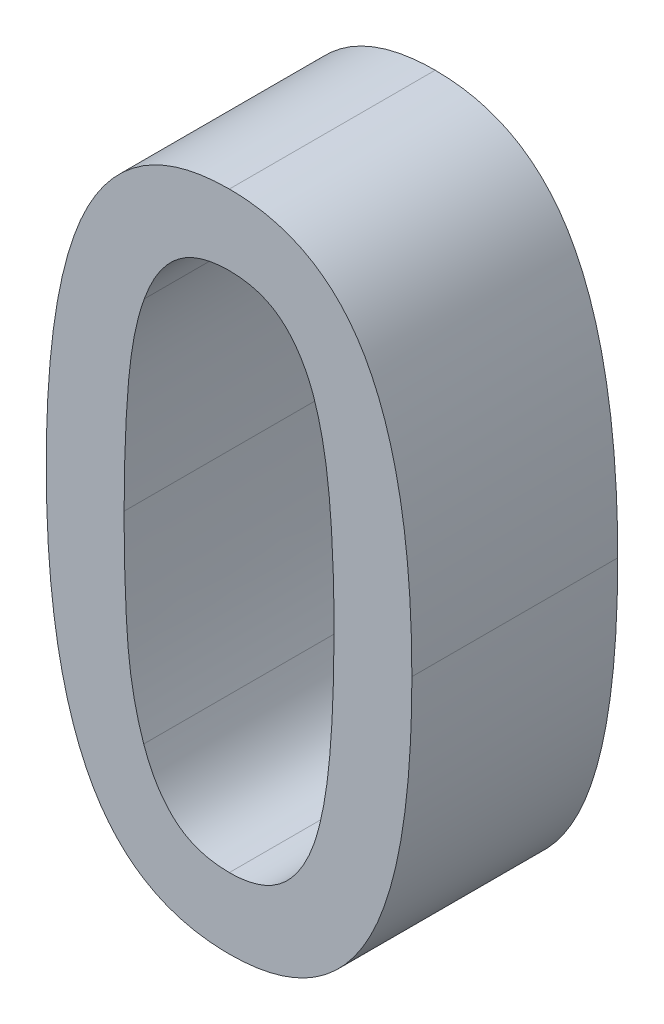
ISO-10303-21;
HEADER;
FILE_DESCRIPTION(('STEP AP214'),'2;1');
FILE_NAME('part.step','',(''),(''),'','','');
FILE_SCHEMA(('AUTOMOTIVE_DESIGN { 1 0 10303 214 1 1 1 1 }'));
ENDSEC;
DATA;
#1=APPLICATION_CONTEXT('core data for automotive mechanical design processes');
#2=APPLICATION_PROTOCOL_DEFINITION('international standard','automotive_design',2000,#1);
#3=PRODUCT_CONTEXT('',#1,'mechanical');
#4=PRODUCT('Part','Part','',(#3));
#5=PRODUCT_RELATED_PRODUCT_CATEGORY('part','',(#4));
#6=PRODUCT_DEFINITION_FORMATION('','',#4);
#7=PRODUCT_DEFINITION_CONTEXT('part definition',#1,'design');
#8=PRODUCT_DEFINITION('design','',#6,#7);
#9=PRODUCT_DEFINITION_SHAPE('','',#8);
#10=(LENGTH_UNIT() NAMED_UNIT(*) SI_UNIT(.MILLI.,.METRE.));
#11=(NAMED_UNIT(*) PLANE_ANGLE_UNIT() SI_UNIT($,.RADIAN.));
#12=(NAMED_UNIT(*) SI_UNIT($,.STERADIAN.) SOLID_ANGLE_UNIT());
#13=UNCERTAINTY_MEASURE_WITH_UNIT(LENGTH_MEASURE(1.E-05),#10,'distance_accuracy_value','');
#14=(GEOMETRIC_REPRESENTATION_CONTEXT(3) GLOBAL_UNCERTAINTY_ASSIGNED_CONTEXT((#13)) GLOBAL_UNIT_ASSIGNED_CONTEXT((#10,
#11,#12)) REPRESENTATION_CONTEXT('',''));
#15=CARTESIAN_POINT('',(0.,0.,0.));
#16=DIRECTION('',(0.,0.,1.));
#17=DIRECTION('',(1.,0.,0.));
#18=AXIS2_PLACEMENT_3D('',#15,#16,#17);
#19=CARTESIAN_POINT('',(-3.784527907438,0.217231574603514,0.));
#20=CARTESIAN_POINT('',(-3.784527907438,0.217231574603514,0.1));
#21=CARTESIAN_POINT('',(-3.769248087482,0.217231574603514,0.));
#22=CARTESIAN_POINT('',(-3.769248087482,0.217231574603514,0.1));
#23=CARTESIAN_POINT('',(-3.749208979342,0.233513349966919,0.));
#24=CARTESIAN_POINT('',(-3.749208979342,0.233513349966919,0.1));
#25=CARTESIAN_POINT('',(-3.743447735752,0.249795125330325,0.));
#26=CARTESIAN_POINT('',(-3.743447735752,0.249795125330325,0.1));
#27=B_SPLINE_SURFACE_WITH_KNOTS('',2,1,((#19,#20),(#21,#22),(#23,#24),(#25,#26)),.UNSPECIFIED.,
.F.,.F.,.F.,(3,1,3),(2,2),(0.,1.,2.),(0.,0.01),.UNSPECIFIED.);
#28=CARTESIAN_POINT('',(-3.784527907438,0.217231574603514,0.));
#29=CARTESIAN_POINT('',(-3.769248087482,0.217231574603514,0.));
#30=CARTESIAN_POINT('',(-3.749208979342,0.233513349966919,0.));
#31=CARTESIAN_POINT('',(-3.743447735752,0.249795125330325,0.));
#32=B_SPLINE_CURVE_WITH_KNOTS('',2,(#28,#29,#30,#31),.UNSPECIFIED.,.F.,.F.,(3,1,3),(0.,1.,2.),.UNSPECIFIED.);
#33=CARTESIAN_POINT('',(-3.784527907438,0.217231574603514,0.));
#34=VERTEX_POINT('',#33);
#35=CARTESIAN_POINT('',(-3.743447735752,0.249795125330325,0.));
#36=VERTEX_POINT('',#35);
#37=EDGE_CURVE('E11',#34,#36,#32,.T.);
#38=DIRECTION('',(0.,0.,1.));
#39=VECTOR('',#38,1.);
#40=CARTESIAN_POINT('',(-3.784527907438,0.217231574603514,0.));
#41=LINE('',#40,#39);
#42=CARTESIAN_POINT('',(-3.784527907438,0.217231574603514,0.1));
#43=VERTEX_POINT('',#42);
#44=EDGE_CURVE('E28',#34,#43,#41,.T.);
#45=CARTESIAN_POINT('',(-3.743447735752,0.249795125330325,0.1));
#46=CARTESIAN_POINT('',(-3.749208979342,0.233513349966919,0.1));
#47=CARTESIAN_POINT('',(-3.769248087482,0.217231574603514,0.1));
#48=CARTESIAN_POINT('',(-3.784527907438,0.217231574603514,0.1));
#49=B_SPLINE_CURVE_WITH_KNOTS('',2,(#45,#46,#47,#48),.UNSPECIFIED.,.F.,.F.,(3,1,3),(-2.,-1.,0.),.UNSPECIFIED.);
#50=CARTESIAN_POINT('',(-3.743447735752,0.249795125330325,0.1));
#51=VERTEX_POINT('',#50);
#52=EDGE_CURVE('E317',#51,#43,#49,.T.);
#53=DIRECTION('',(0.,0.,1.));
#54=VECTOR('',#53,1.);
#55=CARTESIAN_POINT('',(-3.743447735752,0.249795125330325,0.));
#56=LINE('',#55,#54);
#57=EDGE_CURVE('E41',#36,#51,#56,.T.);
#58=ORIENTED_EDGE('',*,*,#37,.F.);
#59=ORIENTED_EDGE('',*,*,#44,.T.);
#60=ORIENTED_EDGE('',*,*,#52,.F.);
#61=ORIENTED_EDGE('',*,*,#57,.F.);
#62=EDGE_LOOP('',(#58,#59,#60,#61));
#63=FACE_BOUND('',#62,.T.);
#64=ADVANCED_FACE('F17',(#63),#27,.F.);
#65=CARTESIAN_POINT('',(-3.826109056828,0.250546591885559,0.));
#66=CARTESIAN_POINT('',(-3.826109056828,0.250546591885559,0.1));
#67=CARTESIAN_POINT('',(-3.82059830209,0.234515305373898,0.));
#68=CARTESIAN_POINT('',(-3.82059830209,0.234515305373898,0.1));
#69=CARTESIAN_POINT('',(-3.800809682802,0.217231574603514,0.));
#70=CARTESIAN_POINT('',(-3.800809682802,0.217231574603514,0.1));
#71=CARTESIAN_POINT('',(-3.784527907438,0.217231574603514,0.));
#72=CARTESIAN_POINT('',(-3.784527907438,0.217231574603514,0.1));
#73=B_SPLINE_SURFACE_WITH_KNOTS('',2,1,((#65,#66),(#67,#68),(#69,#70),(#71,#72)),.UNSPECIFIED.,
.F.,.F.,.F.,(3,1,3),(2,2),(0.,1.,2.),(0.,0.01),.UNSPECIFIED.);
#74=CARTESIAN_POINT('',(-3.826109056828,0.250546591885559,0.));
#75=CARTESIAN_POINT('',(-3.82059830209,0.234515305373898,0.));
#76=CARTESIAN_POINT('',(-3.800809682802,0.217231574603514,0.));
#77=CARTESIAN_POINT('',(-3.784527907438,0.217231574603514,0.));
#78=B_SPLINE_CURVE_WITH_KNOTS('',2,(#74,#75,#76,#77),.UNSPECIFIED.,.F.,.F.,(3,1,3),(0.,1.,2.),.UNSPECIFIED.);
#79=CARTESIAN_POINT('',(-3.826109056828,0.250546591885559,0.));
#80=VERTEX_POINT('',#79);
#81=EDGE_CURVE('E308',#80,#34,#78,.T.);
#82=DIRECTION('',(0.,0.,1.));
#83=VECTOR('',#82,1.);
#84=CARTESIAN_POINT('',(-3.826109056828,0.250546591885559,0.));
#85=LINE('',#84,#83);
#86=CARTESIAN_POINT('',(-3.826109056828,0.250546591885559,0.1));
#87=VERTEX_POINT('',#86);
#88=EDGE_CURVE('E302',#80,#87,#85,.T.);
#89=CARTESIAN_POINT('',(-3.784527907438,0.217231574603514,0.1));
#90=CARTESIAN_POINT('',(-3.800809682802,0.217231574603514,0.1));
#91=CARTESIAN_POINT('',(-3.82059830209,0.234515305373898,0.1));
#92=CARTESIAN_POINT('',(-3.826109056828,0.250546591885559,0.1));
#93=B_SPLINE_CURVE_WITH_KNOTS('',2,(#89,#90,#91,#92),.UNSPECIFIED.,.F.,.F.,(3,1,3),(-2.,-1.,0.),.UNSPECIFIED.);
#94=EDGE_CURVE('E295',#43,#87,#93,.T.);
#95=ORIENTED_EDGE('',*,*,#81,.F.);
#96=ORIENTED_EDGE('',*,*,#88,.T.);
#97=ORIENTED_EDGE('',*,*,#94,.F.);
#98=ORIENTED_EDGE('',*,*,#44,.F.);
#99=EDGE_LOOP('',(#95,#96,#97,#98));
#100=FACE_BOUND('',#99,.T.);
#101=ADVANCED_FACE('F323',(#100),#73,.F.);
#102=CARTESIAN_POINT('',(-3.835627633194,0.343728444734587,0.));
#103=CARTESIAN_POINT('',(-3.835627633194,0.343728444734587,0.1));
#104=CARTESIAN_POINT('',(-3.835627633194,0.311164894007776,0.));
#105=CARTESIAN_POINT('',(-3.835627633194,0.311164894007776,0.1));
#106=CARTESIAN_POINT('',(-3.83212078927,0.267579833804199,0.));
#107=CARTESIAN_POINT('',(-3.83212078927,0.267579833804199,0.1));
#108=CARTESIAN_POINT('',(-3.826109056828,0.250546591885559,0.));
#109=CARTESIAN_POINT('',(-3.826109056828,0.250546591885559,0.1));
#110=B_SPLINE_SURFACE_WITH_KNOTS('',2,1,((#102,#103),(#104,#105),(#106,#107),(#108,#109)),
.UNSPECIFIED.,.F.,.F.,.F.,(3,1,3),(2,2),(0.,1.,2.),(0.,0.01),.UNSPECIFIED.);
#111=CARTESIAN_POINT('',(-3.835627633194,0.343728444734587,0.));
#112=CARTESIAN_POINT('',(-3.835627633194,0.311164894007776,0.));
#113=CARTESIAN_POINT('',(-3.83212078927,0.267579833804199,0.));
#114=CARTESIAN_POINT('',(-3.826109056828,0.250546591885559,0.));
#115=B_SPLINE_CURVE_WITH_KNOTS('',2,(#111,#112,#113,#114),.UNSPECIFIED.,.F.,.F.,(3,1,3),(0.,1.,
2.),.UNSPECIFIED.);
#116=CARTESIAN_POINT('',(-3.835627633194,0.343728444734587,0.));
#117=VERTEX_POINT('',#116);
#118=EDGE_CURVE('E290',#117,#80,#115,.T.);
#119=DIRECTION('',(0.,0.,1.));
#120=VECTOR('',#119,1.);
#121=CARTESIAN_POINT('',(-3.835627633194,0.343728444734587,0.));
#122=LINE('',#121,#120);
#123=CARTESIAN_POINT('',(-3.835627633194,0.343728444734587,0.1));
#124=VERTEX_POINT('',#123);
#125=EDGE_CURVE('E284',#117,#124,#122,.T.);
#126=CARTESIAN_POINT('',(-3.826109056828,0.250546591885559,0.1));
#127=CARTESIAN_POINT('',(-3.83212078927,0.267579833804199,0.1));
#128=CARTESIAN_POINT('',(-3.835627633194,0.311164894007776,0.1));
#129=CARTESIAN_POINT('',(-3.835627633194,0.343728444734587,0.1));
#130=B_SPLINE_CURVE_WITH_KNOTS('',2,(#126,#127,#128,#129),.UNSPECIFIED.,.F.,.F.,(3,1,3),(-2.,
-1.,0.),.UNSPECIFIED.);
#131=EDGE_CURVE('E277',#87,#124,#130,.T.);
#132=ORIENTED_EDGE('',*,*,#118,.F.);
#133=ORIENTED_EDGE('',*,*,#125,.T.);
#134=ORIENTED_EDGE('',*,*,#131,.F.);
#135=ORIENTED_EDGE('',*,*,#88,.F.);
#136=EDGE_LOOP('',(#132,#133,#134,#135));
#137=FACE_BOUND('',#136,.T.);
#138=ADVANCED_FACE('F336',(#137),#110,.F.);
#139=CARTESIAN_POINT('',(-3.825858567976,0.437912252990594,0.));
#140=CARTESIAN_POINT('',(-3.825858567976,0.437912252990594,0.1));
#141=CARTESIAN_POINT('',(-3.831619811566,0.422131455330678,0.));
#142=CARTESIAN_POINT('',(-3.831619811566,0.422131455330678,0.1));
#143=CARTESIAN_POINT('',(-3.835627633194,0.374037595795696,0.));
#144=CARTESIAN_POINT('',(-3.835627633194,0.374037595795696,0.1));
#145=CARTESIAN_POINT('',(-3.835627633194,0.343728444734587,0.));
#146=CARTESIAN_POINT('',(-3.835627633194,0.343728444734587,0.1));
#147=B_SPLINE_SURFACE_WITH_KNOTS('',2,1,((#139,#140),(#141,#142),(#143,#144),(#145,#146)),
.UNSPECIFIED.,.F.,.F.,.F.,(3,1,3),(2,2),(0.,1.,2.),(0.,0.01),.UNSPECIFIED.);
#148=CARTESIAN_POINT('',(-3.825858567976,0.437912252990594,0.));
#149=CARTESIAN_POINT('',(-3.831619811566,0.422131455330678,0.));
#150=CARTESIAN_POINT('',(-3.835627633194,0.374037595795696,0.));
#151=CARTESIAN_POINT('',(-3.835627633194,0.343728444734587,0.));
#152=B_SPLINE_CURVE_WITH_KNOTS('',2,(#148,#149,#150,#151),.UNSPECIFIED.,.F.,.F.,(3,1,3),(0.,1.,
2.),.UNSPECIFIED.);
#153=CARTESIAN_POINT('',(-3.825858567976,0.437912252990594,0.));
#154=VERTEX_POINT('',#153);
#155=EDGE_CURVE('E272',#154,#117,#152,.T.);
#156=DIRECTION('',(0.,0.,1.));
#157=VECTOR('',#156,1.);
#158=CARTESIAN_POINT('',(-3.825858567976,0.437912252990594,0.));
#159=LINE('',#158,#157);
#160=CARTESIAN_POINT('',(-3.825858567976,0.437912252990594,0.1));
#161=VERTEX_POINT('',#160);
#162=EDGE_CURVE('E266',#154,#161,#159,.T.);
#163=CARTESIAN_POINT('',(-3.835627633194,0.343728444734587,0.1));
#164=CARTESIAN_POINT('',(-3.835627633194,0.374037595795696,0.1));
#165=CARTESIAN_POINT('',(-3.831619811566,0.422131455330678,0.1));
#166=CARTESIAN_POINT('',(-3.825858567976,0.437912252990594,0.1));
#167=B_SPLINE_CURVE_WITH_KNOTS('',2,(#163,#164,#165,#166),.UNSPECIFIED.,.F.,.F.,(3,1,3),(-2.,
-1.,0.),.UNSPECIFIED.);
#168=EDGE_CURVE('E259',#124,#161,#167,.T.);
#169=ORIENTED_EDGE('',*,*,#155,.F.);
#170=ORIENTED_EDGE('',*,*,#162,.T.);
#171=ORIENTED_EDGE('',*,*,#168,.F.);
#172=ORIENTED_EDGE('',*,*,#125,.F.);
#173=EDGE_LOOP('',(#169,#170,#171,#172));
#174=FACE_BOUND('',#173,.T.);
#175=ADVANCED_FACE('F339',(#174),#147,.F.);
#176=CARTESIAN_POINT('',(-3.784527907438,0.470475803717405,0.));
#177=CARTESIAN_POINT('',(-3.784527907438,0.470475803717405,0.1));
#178=CARTESIAN_POINT('',(-3.800058216246,0.470475803717405,0.));
#179=CARTESIAN_POINT('',(-3.800058216246,0.470475803717405,0.1));
#180=CARTESIAN_POINT('',(-3.820097324386,0.454194028354,0.));
#181=CARTESIAN_POINT('',(-3.820097324386,0.454194028354,0.1));
#182=CARTESIAN_POINT('',(-3.825858567976,0.437912252990594,0.));
#183=CARTESIAN_POINT('',(-3.825858567976,0.437912252990594,0.1));
#184=B_SPLINE_SURFACE_WITH_KNOTS('',2,1,((#176,#177),(#178,#179),(#180,#181),(#182,#183)),
.UNSPECIFIED.,.F.,.F.,.F.,(3,1,3),(2,2),(0.,1.,2.),(0.,0.01),.UNSPECIFIED.);
#185=CARTESIAN_POINT('',(-3.784527907438,0.470475803717405,0.));
#186=CARTESIAN_POINT('',(-3.800058216246,0.470475803717405,0.));
#187=CARTESIAN_POINT('',(-3.820097324386,0.454194028354,0.));
#188=CARTESIAN_POINT('',(-3.825858567976,0.437912252990594,0.));
#189=B_SPLINE_CURVE_WITH_KNOTS('',2,(#185,#186,#187,#188),.UNSPECIFIED.,.F.,.F.,(3,1,3),(0.,1.,
2.),.UNSPECIFIED.);
#190=CARTESIAN_POINT('',(-3.784527907438,0.470475803717405,0.));
#191=VERTEX_POINT('',#190);
#192=EDGE_CURVE('E254',#191,#154,#189,.T.);
#193=DIRECTION('',(0.,0.,1.));
#194=VECTOR('',#193,1.);
#195=CARTESIAN_POINT('',(-3.784527907438,0.470475803717405,0.));
#196=LINE('',#195,#194);
#197=CARTESIAN_POINT('',(-3.784527907438,0.470475803717405,0.1));
#198=VERTEX_POINT('',#197);
#199=EDGE_CURVE('E248',#191,#198,#196,.T.);
#200=CARTESIAN_POINT('',(-3.825858567976,0.437912252990594,0.1));
#201=CARTESIAN_POINT('',(-3.820097324386,0.454194028354,0.1));
#202=CARTESIAN_POINT('',(-3.800058216246,0.470475803717405,0.1));
#203=CARTESIAN_POINT('',(-3.784527907438,0.470475803717405,0.1));
#204=B_SPLINE_CURVE_WITH_KNOTS('',2,(#200,#201,#202,#203),.UNSPECIFIED.,.F.,.F.,(3,1,3),(-2.,
-1.,0.),.UNSPECIFIED.);
#205=EDGE_CURVE('E241',#161,#198,#204,.T.);
#206=ORIENTED_EDGE('',*,*,#192,.F.);
#207=ORIENTED_EDGE('',*,*,#199,.T.);
#208=ORIENTED_EDGE('',*,*,#205,.F.);
#209=ORIENTED_EDGE('',*,*,#162,.F.);
#210=EDGE_LOOP('',(#206,#207,#208,#209));
#211=FACE_BOUND('',#210,.T.);
#212=ADVANCED_FACE('F344',(#211),#184,.F.);
#213=CARTESIAN_POINT('',(-3.743698224604,0.438413230694084,0.));
#214=CARTESIAN_POINT('',(-3.743698224604,0.438413230694084,0.1));
#215=CARTESIAN_POINT('',(-3.749459468194,0.454194028354,0.));
#216=CARTESIAN_POINT('',(-3.749459468194,0.454194028354,0.1));
#217=CARTESIAN_POINT('',(-3.76899759863,0.470475803717405,0.));
#218=CARTESIAN_POINT('',(-3.76899759863,0.470475803717405,0.1));
#219=CARTESIAN_POINT('',(-3.784527907438,0.470475803717405,0.));
#220=CARTESIAN_POINT('',(-3.784527907438,0.470475803717405,0.1));
#221=B_SPLINE_SURFACE_WITH_KNOTS('',2,1,((#213,#214),(#215,#216),(#217,#218),(#219,#220)),
.UNSPECIFIED.,.F.,.F.,.F.,(3,1,3),(2,2),(0.,1.,2.),(0.,0.01),.UNSPECIFIED.);
#222=CARTESIAN_POINT('',(-3.743698224604,0.438413230694084,0.));
#223=CARTESIAN_POINT('',(-3.749459468194,0.454194028354,0.));
#224=CARTESIAN_POINT('',(-3.76899759863,0.470475803717405,0.));
#225=CARTESIAN_POINT('',(-3.784527907438,0.470475803717405,0.));
#226=B_SPLINE_CURVE_WITH_KNOTS('',2,(#222,#223,#224,#225),.UNSPECIFIED.,.F.,.F.,(3,1,3),(0.,1.,
2.),.UNSPECIFIED.);
#227=CARTESIAN_POINT('',(-3.743698224604,0.438413230694084,0.));
#228=VERTEX_POINT('',#227);
#229=EDGE_CURVE('E236',#228,#191,#226,.T.);
#230=DIRECTION('',(0.,0.,1.));
#231=VECTOR('',#230,1.);
#232=CARTESIAN_POINT('',(-3.743698224604,0.438413230694084,0.));
#233=LINE('',#232,#231);
#234=CARTESIAN_POINT('',(-3.743698224604,0.438413230694084,0.1));
#235=VERTEX_POINT('',#234);
#236=EDGE_CURVE('E230',#228,#235,#233,.T.);
#237=CARTESIAN_POINT('',(-3.784527907438,0.470475803717405,0.1));
#238=CARTESIAN_POINT('',(-3.76899759863,0.470475803717405,0.1));
#239=CARTESIAN_POINT('',(-3.749459468194,0.454194028354,0.1));
#240=CARTESIAN_POINT('',(-3.743698224604,0.438413230694084,0.1));
#241=B_SPLINE_CURVE_WITH_KNOTS('',2,(#237,#238,#239,#240),.UNSPECIFIED.,.F.,.F.,(3,1,3),(-2.,
-1.,0.),.UNSPECIFIED.);
#242=EDGE_CURVE('E223',#198,#235,#241,.T.);
#243=ORIENTED_EDGE('',*,*,#229,.F.);
#244=ORIENTED_EDGE('',*,*,#236,.T.);
#245=ORIENTED_EDGE('',*,*,#242,.F.);
#246=ORIENTED_EDGE('',*,*,#199,.F.);
#247=EDGE_LOOP('',(#243,#244,#245,#246));
#248=FACE_BOUND('',#247,.T.);
#249=ADVANCED_FACE('F347',(#248),#221,.F.);
#250=CARTESIAN_POINT('',(-3.733678670534,0.343978933586332,0.));
#251=CARTESIAN_POINT('',(-3.733678670534,0.343978933586332,0.1));
#252=CARTESIAN_POINT('',(-3.733678670534,0.375791017757909,0.));
#253=CARTESIAN_POINT('',(-3.733678670534,0.375791017757909,0.1));
#254=CARTESIAN_POINT('',(-3.738187469866,0.422632433034168,0.));
#255=CARTESIAN_POINT('',(-3.738187469866,0.422632433034168,0.1));
#256=CARTESIAN_POINT('',(-3.743698224604,0.438413230694084,0.));
#257=CARTESIAN_POINT('',(-3.743698224604,0.438413230694084,0.1));
#258=B_SPLINE_SURFACE_WITH_KNOTS('',2,1,((#250,#251),(#252,#253),(#254,#255),(#256,#257)),
.UNSPECIFIED.,.F.,.F.,.F.,(3,1,3),(2,2),(0.,1.,2.),(0.,0.01),.UNSPECIFIED.);
#259=CARTESIAN_POINT('',(-3.733678670534,0.343978933586332,0.));
#260=CARTESIAN_POINT('',(-3.733678670534,0.375791017757909,0.));
#261=CARTESIAN_POINT('',(-3.738187469866,0.422632433034168,0.));
#262=CARTESIAN_POINT('',(-3.743698224604,0.438413230694084,0.));
#263=B_SPLINE_CURVE_WITH_KNOTS('',2,(#259,#260,#261,#262),.UNSPECIFIED.,.F.,.F.,(3,1,3),(0.,1.,
2.),.UNSPECIFIED.);
#264=CARTESIAN_POINT('',(-3.733678670534,0.343978933586332,0.));
#265=VERTEX_POINT('',#264);
#266=EDGE_CURVE('E218',#265,#228,#263,.T.);
#267=DIRECTION('',(0.,0.,1.));
#268=VECTOR('',#267,1.);
#269=CARTESIAN_POINT('',(-3.733678670534,0.343978933586332,0.));
#270=LINE('',#269,#268);
#271=CARTESIAN_POINT('',(-3.733678670534,0.343978933586332,0.1));
#272=VERTEX_POINT('',#271);
#273=EDGE_CURVE('E212',#265,#272,#270,.T.);
#274=CARTESIAN_POINT('',(-3.743698224604,0.438413230694084,0.1));
#275=CARTESIAN_POINT('',(-3.738187469866,0.422632433034168,0.1));
#276=CARTESIAN_POINT('',(-3.733678670534,0.375791017757909,0.1));
#277=CARTESIAN_POINT('',(-3.733678670534,0.343978933586332,0.1));
#278=B_SPLINE_CURVE_WITH_KNOTS('',2,(#274,#275,#276,#277),.UNSPECIFIED.,.F.,.F.,(3,1,3),(-2.,
-1.,0.),.UNSPECIFIED.);
#279=EDGE_CURVE('E205',#235,#272,#278,.T.);
#280=ORIENTED_EDGE('',*,*,#266,.F.);
#281=ORIENTED_EDGE('',*,*,#273,.T.);
#282=ORIENTED_EDGE('',*,*,#279,.F.);
#283=ORIENTED_EDGE('',*,*,#236,.F.);
#284=EDGE_LOOP('',(#280,#281,#282,#283));
#285=FACE_BOUND('',#284,.T.);
#286=ADVANCED_FACE('F349',(#285),#258,.F.);
#287=CARTESIAN_POINT('',(-3.743447735752,0.249795125330325,0.));
#288=CARTESIAN_POINT('',(-3.743447735752,0.249795125330325,0.1));
#289=CARTESIAN_POINT('',(-3.738187469866,0.265074945286752,0.));
#290=CARTESIAN_POINT('',(-3.738187469866,0.265074945286752,0.1));
#291=CARTESIAN_POINT('',(-3.733678670534,0.312166849414755,0.));
#292=CARTESIAN_POINT('',(-3.733678670534,0.312166849414755,0.1));
#293=CARTESIAN_POINT('',(-3.733678670534,0.343978933586332,0.));
#294=CARTESIAN_POINT('',(-3.733678670534,0.343978933586332,0.1));
#295=B_SPLINE_SURFACE_WITH_KNOTS('',2,1,((#287,#288),(#289,#290),(#291,#292),(#293,#294)),
.UNSPECIFIED.,.F.,.F.,.F.,(3,1,3),(2,2),(0.,1.,2.),(0.,0.01),.UNSPECIFIED.);
#296=CARTESIAN_POINT('',(-3.743447735752,0.249795125330325,0.));
#297=CARTESIAN_POINT('',(-3.738187469866,0.265074945286752,0.));
#298=CARTESIAN_POINT('',(-3.733678670534,0.312166849414755,0.));
#299=CARTESIAN_POINT('',(-3.733678670534,0.343978933586332,0.));
#300=B_SPLINE_CURVE_WITH_KNOTS('',2,(#296,#297,#298,#299),.UNSPECIFIED.,.F.,.F.,(3,1,3),(0.,1.,
2.),.UNSPECIFIED.);
#301=EDGE_CURVE('E197',#36,#265,#300,.T.);
#302=CARTESIAN_POINT('',(-3.733678670534,0.343978933586332,0.1));
#303=CARTESIAN_POINT('',(-3.733678670534,0.312166849414755,0.1));
#304=CARTESIAN_POINT('',(-3.738187469866,0.265074945286752,0.1));
#305=CARTESIAN_POINT('',(-3.743447735752,0.249795125330325,0.1));
#306=B_SPLINE_CURVE_WITH_KNOTS('',2,(#302,#303,#304,#305),.UNSPECIFIED.,.F.,.F.,(3,1,3),(-2.,
-1.,0.),.UNSPECIFIED.);
#307=EDGE_CURVE('E189',#272,#51,#306,.T.);
#308=ORIENTED_EDGE('',*,*,#301,.F.);
#309=ORIENTED_EDGE('',*,*,#57,.T.);
#310=ORIENTED_EDGE('',*,*,#307,.F.);
#311=ORIENTED_EDGE('',*,*,#273,.F.);
#312=EDGE_LOOP('',(#308,#309,#310,#311));
#313=FACE_BOUND('',#312,.T.);
#314=ADVANCED_FACE('F329',(#313),#295,.F.);
#315=CARTESIAN_POINT('',(-3.873451449808,0.343728444734587,0.));
#316=CARTESIAN_POINT('',(-3.873451449808,0.343728444734587,0.1));
#317=CARTESIAN_POINT('',(-3.873451449808,0.26231956791756,0.));
#318=CARTESIAN_POINT('',(-3.873451449808,0.26231956791756,0.1));
#319=CARTESIAN_POINT('',(-3.830617856159,0.18291460191449,0.));
#320=CARTESIAN_POINT('',(-3.830617856159,0.18291460191449,0.1));
#321=CARTESIAN_POINT('',(-3.784527907438,0.18291460191449,0.));
#322=CARTESIAN_POINT('',(-3.784527907438,0.18291460191449,0.1));
#323=B_SPLINE_SURFACE_WITH_KNOTS('',2,1,((#315,#316),(#317,#318),(#319,#320),(#321,#322)),
.UNSPECIFIED.,.F.,.F.,.F.,(3,1,3),(2,2),(-2.,-1.,0.),(0.,0.01),.UNSPECIFIED.);
#324=CARTESIAN_POINT('',(-3.784527907438,0.18291460191449,0.));
#325=CARTESIAN_POINT('',(-3.830617856159,0.18291460191449,0.));
#326=CARTESIAN_POINT('',(-3.873451449808,0.26231956791756,0.));
#327=CARTESIAN_POINT('',(-3.873451449808,0.343728444734587,0.));
#328=B_SPLINE_CURVE_WITH_KNOTS('',2,(#324,#325,#326,#327),.UNSPECIFIED.,.F.,.F.,(3,1,3),(0.,1.,
2.),.UNSPECIFIED.);
#329=CARTESIAN_POINT('',(-3.784527907438,0.18291460191449,0.));
#330=VERTEX_POINT('',#329);
#331=CARTESIAN_POINT('',(-3.873451449808,0.343728444734587,0.));
#332=VERTEX_POINT('',#331);
#333=EDGE_CURVE('E185',#330,#332,#328,.T.);
#334=DIRECTION('',(0.,0.,1.));
#335=VECTOR('',#334,1.);
#336=CARTESIAN_POINT('',(-3.784527907438,0.18291460191449,0.));
#337=LINE('',#336,#335);
#338=CARTESIAN_POINT('',(-3.784527907438,0.18291460191449,0.1));
#339=VERTEX_POINT('',#338);
#340=EDGE_CURVE('E180',#330,#339,#337,.T.);
#341=CARTESIAN_POINT('',(-3.873451449808,0.343728444734587,0.1));
#342=CARTESIAN_POINT('',(-3.873451449808,0.26231956791756,0.1));
#343=CARTESIAN_POINT('',(-3.830617856159,0.18291460191449,0.1));
#344=CARTESIAN_POINT('',(-3.784527907438,0.18291460191449,0.1));
#345=B_SPLINE_CURVE_WITH_KNOTS('',2,(#341,#342,#343,#344),.UNSPECIFIED.,.F.,.F.,(3,1,3),(-2.,
-1.,0.),.UNSPECIFIED.);
#346=CARTESIAN_POINT('',(-3.873451449808,0.343728444734587,0.1));
#347=VERTEX_POINT('',#346);
#348=EDGE_CURVE('E134',#347,#339,#345,.T.);
#349=DIRECTION('',(0.,0.,1.));
#350=VECTOR('',#349,1.);
#351=CARTESIAN_POINT('',(-3.873451449808,0.343728444734587,0.));
#352=LINE('',#351,#350);
#353=EDGE_CURVE('E171',#332,#347,#352,.T.);
#354=ORIENTED_EDGE('',*,*,#333,.F.);
#355=ORIENTED_EDGE('',*,*,#340,.T.);
#356=ORIENTED_EDGE('',*,*,#348,.F.);
#357=ORIENTED_EDGE('',*,*,#353,.F.);
#358=EDGE_LOOP('',(#354,#355,#356,#357));
#359=FACE_BOUND('',#358,.T.);
#360=ADVANCED_FACE('F357',(#359),#323,.T.);
#361=CARTESIAN_POINT('',(-3.784527907438,0.504792776406429,0.));
#362=CARTESIAN_POINT('',(-3.784527907438,0.504792776406429,0.1));
#363=CARTESIAN_POINT('',(-3.829866389604,0.504792776406429,0.));
#364=CARTESIAN_POINT('',(-3.829866389604,0.504792776406429,0.1));
#365=CARTESIAN_POINT('',(-3.873451449808,0.427391721217317,0.));
#366=CARTESIAN_POINT('',(-3.873451449808,0.427391721217317,0.1));
#367=CARTESIAN_POINT('',(-3.873451449808,0.343728444734587,0.));
#368=CARTESIAN_POINT('',(-3.873451449808,0.343728444734587,0.1));
#369=B_SPLINE_SURFACE_WITH_KNOTS('',2,1,((#361,#362),(#363,#364),(#365,#366),(#367,#368)),
.UNSPECIFIED.,.F.,.F.,.F.,(3,1,3),(2,2),(-2.,-1.,0.),(0.,0.01),.UNSPECIFIED.);
#370=CARTESIAN_POINT('',(-3.873451449808,0.343728444734587,0.));
#371=CARTESIAN_POINT('',(-3.873451449808,0.427391721217317,0.));
#372=CARTESIAN_POINT('',(-3.829866389604,0.504792776406429,0.));
#373=CARTESIAN_POINT('',(-3.784527907438,0.504792776406429,0.));
#374=B_SPLINE_CURVE_WITH_KNOTS('',2,(#370,#371,#372,#373),.UNSPECIFIED.,.F.,.F.,(3,1,3),(0.,1.,
2.),.UNSPECIFIED.);
#375=CARTESIAN_POINT('',(-3.784527907438,0.504792776406429,0.));
#376=VERTEX_POINT('',#375);
#377=EDGE_CURVE('E164',#332,#376,#374,.T.);
#378=CARTESIAN_POINT('',(-3.784527907438,0.504792776406429,0.1));
#379=CARTESIAN_POINT('',(-3.829866389604,0.504792776406429,0.1));
#380=CARTESIAN_POINT('',(-3.873451449808,0.427391721217317,0.1));
#381=CARTESIAN_POINT('',(-3.873451449808,0.343728444734587,0.1));
#382=B_SPLINE_CURVE_WITH_KNOTS('',2,(#378,#379,#380,#381),.UNSPECIFIED.,.F.,.F.,(3,1,3),(-2.,
-1.,0.),.UNSPECIFIED.);
#383=CARTESIAN_POINT('',(-3.784527907438,0.504792776406429,0.1));
#384=VERTEX_POINT('',#383);
#385=EDGE_CURVE('E160',#384,#347,#382,.T.);
#386=DIRECTION('',(0.,0.,1.));
#387=VECTOR('',#386,1.);
#388=CARTESIAN_POINT('',(-3.784527907438,0.504792776406429,0.));
#389=LINE('',#388,#387);
#390=EDGE_CURVE('E117',#376,#384,#389,.T.);
#391=ORIENTED_EDGE('',*,*,#377,.F.);
#392=ORIENTED_EDGE('',*,*,#353,.T.);
#393=ORIENTED_EDGE('',*,*,#385,.F.);
#394=ORIENTED_EDGE('',*,*,#390,.F.);
#395=EDGE_LOOP('',(#391,#392,#393,#394));
#396=FACE_BOUND('',#395,.T.);
#397=ADVANCED_FACE('F444',(#396),#369,.T.);
#398=CARTESIAN_POINT('',(-3.695854853921,0.343978933586332,0.));
#399=CARTESIAN_POINT('',(-3.695854853921,0.343978933586332,0.1));
#400=CARTESIAN_POINT('',(-3.695854853921,0.424636343848125,0.));
#401=CARTESIAN_POINT('',(-3.695854853921,0.424636343848125,0.1));
#402=CARTESIAN_POINT('',(-3.738688447569,0.504792776406429,0.));
#403=CARTESIAN_POINT('',(-3.738688447569,0.504792776406429,0.1));
#404=CARTESIAN_POINT('',(-3.784527907438,0.504792776406429,0.));
#405=CARTESIAN_POINT('',(-3.784527907438,0.504792776406429,0.1));
#406=B_SPLINE_SURFACE_WITH_KNOTS('',2,1,((#398,#399),(#400,#401),(#402,#403),(#404,#405)),
.UNSPECIFIED.,.F.,.F.,.F.,(3,1,3),(2,2),(-2.,-1.,0.),(0.,0.01),.UNSPECIFIED.);
#407=CARTESIAN_POINT('',(-3.784527907438,0.504792776406429,0.));
#408=CARTESIAN_POINT('',(-3.738688447569,0.504792776406429,0.));
#409=CARTESIAN_POINT('',(-3.695854853921,0.424636343848125,0.));
#410=CARTESIAN_POINT('',(-3.695854853921,0.343978933586332,0.));
#411=B_SPLINE_CURVE_WITH_KNOTS('',2,(#407,#408,#409,#410),.UNSPECIFIED.,.F.,.F.,(3,1,3),(0.,1.,
2.),.UNSPECIFIED.);
#412=CARTESIAN_POINT('',(-3.695854853921,0.343978933586332,0.));
#413=VERTEX_POINT('',#412);
#414=EDGE_CURVE('E121',#376,#413,#411,.T.);
#415=CARTESIAN_POINT('',(-3.695854853921,0.343978933586332,0.1));
#416=CARTESIAN_POINT('',(-3.695854853921,0.424636343848125,0.1));
#417=CARTESIAN_POINT('',(-3.738688447569,0.504792776406429,0.1));
#418=CARTESIAN_POINT('',(-3.784527907438,0.504792776406429,0.1));
#419=B_SPLINE_CURVE_WITH_KNOTS('',2,(#415,#416,#417,#418),.UNSPECIFIED.,.F.,.F.,(3,1,3),(-2.,
-1.,0.),.UNSPECIFIED.);
#420=CARTESIAN_POINT('',(-3.695854853921,0.343978933586332,0.1));
#421=VERTEX_POINT('',#420);
#422=EDGE_CURVE('E110',#421,#384,#419,.T.);
#423=DIRECTION('',(0.,0.,1.));
#424=VECTOR('',#423,1.);
#425=CARTESIAN_POINT('',(-3.695854853921,0.343978933586332,0.));
#426=LINE('',#425,#424);
#427=EDGE_CURVE('E114',#413,#421,#426,.T.);
#428=ORIENTED_EDGE('',*,*,#414,.F.);
#429=ORIENTED_EDGE('',*,*,#390,.T.);
#430=ORIENTED_EDGE('',*,*,#422,.F.);
#431=ORIENTED_EDGE('',*,*,#427,.F.);
#432=EDGE_LOOP('',(#428,#429,#430,#431));
#433=FACE_BOUND('',#432,.T.);
#434=ADVANCED_FACE('F113',(#433),#406,.T.);
#435=CARTESIAN_POINT('',(-3.784527907438,0.18291460191449,0.));
#436=CARTESIAN_POINT('',(-3.784527907438,0.18291460191449,0.1));
#437=CARTESIAN_POINT('',(-3.739439914124,0.18291460191449,0.));
#438=CARTESIAN_POINT('',(-3.739439914124,0.18291460191449,0.1));
#439=CARTESIAN_POINT('',(-3.695854853921,0.260816634807092,0.));
#440=CARTESIAN_POINT('',(-3.695854853921,0.260816634807092,0.1));
#441=CARTESIAN_POINT('',(-3.695854853921,0.343978933586332,0.));
#442=CARTESIAN_POINT('',(-3.695854853921,0.343978933586332,0.1));
#443=B_SPLINE_SURFACE_WITH_KNOTS('',2,1,((#435,#436),(#437,#438),(#439,#440),(#441,#442)),
.UNSPECIFIED.,.F.,.F.,.F.,(3,1,3),(2,2),(-2.,-1.,0.),(0.,0.01),.UNSPECIFIED.);
#444=CARTESIAN_POINT('',(-3.695854853921,0.343978933586332,0.));
#445=CARTESIAN_POINT('',(-3.695854853921,0.260816634807092,0.));
#446=CARTESIAN_POINT('',(-3.739439914124,0.18291460191449,0.));
#447=CARTESIAN_POINT('',(-3.784527907438,0.18291460191449,0.));
#448=B_SPLINE_CURVE_WITH_KNOTS('',2,(#444,#445,#446,#447),.UNSPECIFIED.,.F.,.F.,(3,1,3),(0.,1.,
2.),.UNSPECIFIED.);
#449=EDGE_CURVE('E129',#413,#330,#448,.T.);
#450=CARTESIAN_POINT('',(-3.784527907438,0.18291460191449,0.1));
#451=CARTESIAN_POINT('',(-3.739439914124,0.18291460191449,0.1));
#452=CARTESIAN_POINT('',(-3.695854853921,0.260816634807092,0.1));
#453=CARTESIAN_POINT('',(-3.695854853921,0.343978933586332,0.1));
#454=B_SPLINE_CURVE_WITH_KNOTS('',2,(#450,#451,#452,#453),.UNSPECIFIED.,.F.,.F.,(3,1,3),(-2.,
-1.,0.),.UNSPECIFIED.);
#455=EDGE_CURVE('E127',#339,#421,#454,.T.);
#456=ORIENTED_EDGE('',*,*,#449,.F.);
#457=ORIENTED_EDGE('',*,*,#427,.T.);
#458=ORIENTED_EDGE('',*,*,#455,.F.);
#459=ORIENTED_EDGE('',*,*,#340,.F.);
#460=EDGE_LOOP('',(#456,#457,#458,#459));
#461=FACE_BOUND('',#460,.T.);
#462=ADVANCED_FACE('F125',(#461),#443,.T.);
#463=CARTESIAN_POINT('',(-3.78469504281,0.343844249215666,0.));
#464=DIRECTION('',(0.,0.,1.));
#465=DIRECTION('',(1.,0.,0.));
#466=AXIS2_PLACEMENT_3D('',#463,#464,#465);
#467=PLANE('',#466);
#468=ORIENTED_EDGE('',*,*,#449,.T.);
#469=ORIENTED_EDGE('',*,*,#333,.T.);
#470=ORIENTED_EDGE('',*,*,#377,.T.);
#471=ORIENTED_EDGE('',*,*,#414,.T.);
#472=EDGE_LOOP('',(#468,#469,#470,#471));
#473=FACE_BOUND('',#472,.T.);
#474=ORIENTED_EDGE('',*,*,#37,.T.);
#475=ORIENTED_EDGE('',*,*,#301,.T.);
#476=ORIENTED_EDGE('',*,*,#266,.T.);
#477=ORIENTED_EDGE('',*,*,#229,.T.);
#478=ORIENTED_EDGE('',*,*,#192,.T.);
#479=ORIENTED_EDGE('',*,*,#155,.T.);
#480=ORIENTED_EDGE('',*,*,#118,.T.);
#481=ORIENTED_EDGE('',*,*,#81,.T.);
#482=EDGE_LOOP('',(#474,#475,#476,#477,#478,#479,#480,#481));
#483=FACE_BOUND('',#482,.T.);
#484=ADVANCED_FACE('F332',(#473,#483),#467,.F.);
#485=CARTESIAN_POINT('',(-3.78469504281,0.343844249215666,0.1));
#486=DIRECTION('',(0.,0.,1.));
#487=DIRECTION('',(1.,0.,0.));
#488=AXIS2_PLACEMENT_3D('',#485,#486,#487);
#489=PLANE('',#488);
#490=ORIENTED_EDGE('',*,*,#455,.T.);
#491=ORIENTED_EDGE('',*,*,#422,.T.);
#492=ORIENTED_EDGE('',*,*,#385,.T.);
#493=ORIENTED_EDGE('',*,*,#348,.T.);
#494=EDGE_LOOP('',(#490,#491,#492,#493));
#495=FACE_BOUND('',#494,.T.);
#496=ORIENTED_EDGE('',*,*,#52,.T.);
#497=ORIENTED_EDGE('',*,*,#94,.T.);
#498=ORIENTED_EDGE('',*,*,#131,.T.);
#499=ORIENTED_EDGE('',*,*,#168,.T.);
#500=ORIENTED_EDGE('',*,*,#205,.T.);
#501=ORIENTED_EDGE('',*,*,#242,.T.);
#502=ORIENTED_EDGE('',*,*,#279,.T.);
#503=ORIENTED_EDGE('',*,*,#307,.T.);
#504=EDGE_LOOP('',(#496,#497,#498,#499,#500,#501,#502,#503));
#505=FACE_BOUND('',#504,.T.);
#506=ADVANCED_FACE('F132',(#495,#505),#489,.T.);
#507=CLOSED_SHELL('',(#64,#101,#138,#175,#212,#249,#286,#314,#360,#397,#434,#462,#484,#506));
#508=MANIFOLD_SOLID_BREP('B1',#507);
#509=ADVANCED_BREP_SHAPE_REPRESENTATION('',(#18,#508),#14);
#510=SHAPE_DEFINITION_REPRESENTATION(#9,#509);
ENDSEC;
END-ISO-10303-21;
